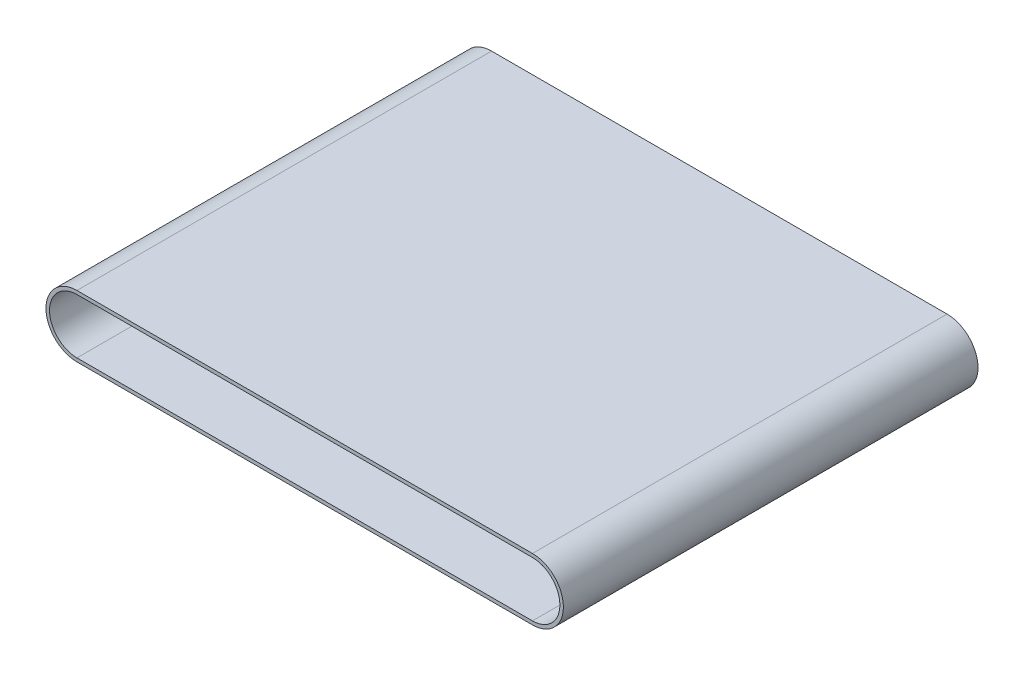
ISO-10303-21;
HEADER;
FILE_DESCRIPTION(('STEP AP214'),'2;1');
FILE_NAME('part.step','',(''),(''),'','','');
FILE_SCHEMA(('AUTOMOTIVE_DESIGN { 1 0 10303 214 1 1 1 1 }'));
ENDSEC;
DATA;
#1=APPLICATION_CONTEXT('core data for automotive mechanical design processes');
#2=APPLICATION_PROTOCOL_DEFINITION('international standard','automotive_design',2000,#1);
#3=PRODUCT_CONTEXT('',#1,'mechanical');
#4=PRODUCT('Part','Part','',(#3));
#5=PRODUCT_RELATED_PRODUCT_CATEGORY('part','',(#4));
#6=PRODUCT_DEFINITION_FORMATION('','',#4);
#7=PRODUCT_DEFINITION_CONTEXT('part definition',#1,'design');
#8=PRODUCT_DEFINITION('design','',#6,#7);
#9=PRODUCT_DEFINITION_SHAPE('','',#8);
#10=(LENGTH_UNIT() NAMED_UNIT(*) SI_UNIT(.MILLI.,.METRE.));
#11=(NAMED_UNIT(*) PLANE_ANGLE_UNIT() SI_UNIT($,.RADIAN.));
#12=(NAMED_UNIT(*) SI_UNIT($,.STERADIAN.) SOLID_ANGLE_UNIT());
#13=UNCERTAINTY_MEASURE_WITH_UNIT(LENGTH_MEASURE(1.E-05),#10,'distance_accuracy_value','');
#14=(GEOMETRIC_REPRESENTATION_CONTEXT(3) GLOBAL_UNCERTAINTY_ASSIGNED_CONTEXT((#13)) GLOBAL_UNIT_ASSIGNED_CONTEXT((#10,
#11,#12)) REPRESENTATION_CONTEXT('',''));
#15=CARTESIAN_POINT('',(0.,0.,0.));
#16=DIRECTION('',(0.,0.,1.));
#17=DIRECTION('',(1.,0.,0.));
#18=AXIS2_PLACEMENT_3D('',#15,#16,#17);
#19=CARTESIAN_POINT('',(-390.,0.,-177.5));
#20=DIRECTION('',(0.,0.,1.));
#21=DIRECTION('',(1.,0.,0.));
#22=AXIS2_PLACEMENT_3D('',#19,#20,#21);
#23=CYLINDRICAL_SURFACE('',#22,26.5);
#24=CARTESIAN_POINT('',(-390.,0.,177.5));
#25=DIRECTION('',(0.,0.,1.));
#26=DIRECTION('',(1.,0.,0.));
#27=AXIS2_PLACEMENT_3D('',#24,#25,#26);
#28=CIRCLE('',#27,26.5);
#29=CARTESIAN_POINT('',(-390.,26.4999999999999,177.5));
#30=VERTEX_POINT('',#29);
#31=CARTESIAN_POINT('',(-390.,-26.5,177.5));
#32=VERTEX_POINT('',#31);
#33=EDGE_CURVE('E131',#30,#32,#28,.T.);
#34=ORIENTED_EDGE('',*,*,#33,.F.);
#35=DIRECTION('',(0.,0.,1.));
#36=VECTOR('',#35,1.);
#37=CARTESIAN_POINT('',(-390.,26.4999999999999,-177.5));
#38=LINE('',#37,#36);
#39=CARTESIAN_POINT('',(-390.,26.4999999999999,-177.5));
#40=VERTEX_POINT('',#39);
#41=EDGE_CURVE('E11',#40,#30,#38,.T.);
#42=ORIENTED_EDGE('',*,*,#41,.F.);
#43=CARTESIAN_POINT('',(-390.,0.,-177.5));
#44=DIRECTION('',(0.,0.,1.));
#45=DIRECTION('',(1.,0.,0.));
#46=AXIS2_PLACEMENT_3D('',#43,#44,#45);
#47=CIRCLE('',#46,26.5);
#48=CARTESIAN_POINT('',(-390.,-26.5,-177.5));
#49=VERTEX_POINT('',#48);
#50=EDGE_CURVE('E135',#40,#49,#47,.T.);
#51=ORIENTED_EDGE('',*,*,#50,.T.);
#52=DIRECTION('',(0.,0.,1.));
#53=VECTOR('',#52,1.);
#54=CARTESIAN_POINT('',(-390.,-26.5,-177.5));
#55=LINE('',#54,#53);
#56=EDGE_CURVE('E36',#49,#32,#55,.T.);
#57=ORIENTED_EDGE('',*,*,#56,.T.);
#58=EDGE_LOOP('',(#34,#42,#51,#57));
#59=FACE_BOUND('',#58,.T.);
#60=ADVANCED_FACE('F33',(#59),#23,.T.);
#61=CARTESIAN_POINT('',(0.,26.5,-177.5));
#62=DIRECTION('',(0.,1.,0.));
#63=DIRECTION('',(-1.,0.,0.));
#64=AXIS2_PLACEMENT_3D('',#61,#62,#63);
#65=PLANE('',#64);
#66=DIRECTION('',(-1.,0.,0.));
#67=VECTOR('',#66,1.);
#68=CARTESIAN_POINT('',(0.,26.5,177.5));
#69=LINE('',#68,#67);
#70=CARTESIAN_POINT('',(0.,26.5,177.5));
#71=VERTEX_POINT('',#70);
#72=EDGE_CURVE('E139',#71,#30,#69,.T.);
#73=ORIENTED_EDGE('',*,*,#72,.F.);
#74=DIRECTION('',(0.,0.,1.));
#75=VECTOR('',#74,1.);
#76=CARTESIAN_POINT('',(0.,26.5,-177.5));
#77=LINE('',#76,#75);
#78=CARTESIAN_POINT('',(0.,26.5,-177.5));
#79=VERTEX_POINT('',#78);
#80=EDGE_CURVE('E41',#79,#71,#77,.T.);
#81=ORIENTED_EDGE('',*,*,#80,.F.);
#82=DIRECTION('',(-1.,0.,0.));
#83=VECTOR('',#82,1.);
#84=CARTESIAN_POINT('',(0.,26.5,-177.5));
#85=LINE('',#84,#83);
#86=EDGE_CURVE('E145',#79,#40,#85,.T.);
#87=ORIENTED_EDGE('',*,*,#86,.T.);
#88=ORIENTED_EDGE('',*,*,#41,.T.);
#89=EDGE_LOOP('',(#73,#81,#87,#88));
#90=FACE_BOUND('',#89,.T.);
#91=ADVANCED_FACE('F171',(#90),#65,.T.);
#92=CARTESIAN_POINT('',(0.,0.,-177.5));
#93=DIRECTION('',(0.,0.,1.));
#94=DIRECTION('',(1.,0.,0.));
#95=AXIS2_PLACEMENT_3D('',#92,#93,#94);
#96=CYLINDRICAL_SURFACE('',#95,26.5);
#97=CARTESIAN_POINT('',(0.,0.,177.5));
#98=DIRECTION('',(0.,0.,1.));
#99=DIRECTION('',(1.,0.,0.));
#100=AXIS2_PLACEMENT_3D('',#97,#98,#99);
#101=CIRCLE('',#100,26.5);
#102=CARTESIAN_POINT('',(0.,-26.5,177.5));
#103=VERTEX_POINT('',#102);
#104=EDGE_CURVE('E153',#103,#71,#101,.T.);
#105=ORIENTED_EDGE('',*,*,#104,.F.);
#106=DIRECTION('',(0.,0.,1.));
#107=VECTOR('',#106,1.);
#108=CARTESIAN_POINT('',(0.,-26.5,-177.5));
#109=LINE('',#108,#107);
#110=CARTESIAN_POINT('',(0.,-26.5,-177.5));
#111=VERTEX_POINT('',#110);
#112=EDGE_CURVE('E158',#111,#103,#109,.T.);
#113=ORIENTED_EDGE('',*,*,#112,.F.);
#114=CARTESIAN_POINT('',(0.,0.,-177.5));
#115=DIRECTION('',(0.,0.,1.));
#116=DIRECTION('',(1.,0.,0.));
#117=AXIS2_PLACEMENT_3D('',#114,#115,#116);
#118=CIRCLE('',#117,26.5);
#119=EDGE_CURVE('E142',#111,#79,#118,.T.);
#120=ORIENTED_EDGE('',*,*,#119,.T.);
#121=ORIENTED_EDGE('',*,*,#80,.T.);
#122=EDGE_LOOP('',(#105,#113,#120,#121));
#123=FACE_BOUND('',#122,.T.);
#124=ADVANCED_FACE('F175',(#123),#96,.T.);
#125=CARTESIAN_POINT('',(-390.,-26.5,-177.5));
#126=DIRECTION('',(0.,-1.,0.));
#127=DIRECTION('',(1.,0.,0.));
#128=AXIS2_PLACEMENT_3D('',#125,#126,#127);
#129=PLANE('',#128);
#130=DIRECTION('',(1.,0.,0.));
#131=VECTOR('',#130,1.);
#132=CARTESIAN_POINT('',(-390.,-26.5,177.5));
#133=LINE('',#132,#131);
#134=EDGE_CURVE('E150',#32,#103,#133,.T.);
#135=ORIENTED_EDGE('',*,*,#134,.F.);
#136=ORIENTED_EDGE('',*,*,#56,.F.);
#137=DIRECTION('',(1.,0.,0.));
#138=VECTOR('',#137,1.);
#139=CARTESIAN_POINT('',(-390.,-26.5,-177.5));
#140=LINE('',#139,#138);
#141=EDGE_CURVE('E138',#49,#111,#140,.T.);
#142=ORIENTED_EDGE('',*,*,#141,.T.);
#143=ORIENTED_EDGE('',*,*,#112,.T.);
#144=EDGE_LOOP('',(#135,#136,#142,#143));
#145=FACE_BOUND('',#144,.T.);
#146=ADVANCED_FACE('F166',(#145),#129,.T.);
#147=CARTESIAN_POINT('',(-390.,0.,-177.5));
#148=DIRECTION('',(0.,0.,1.));
#149=DIRECTION('',(1.,0.,0.));
#150=AXIS2_PLACEMENT_3D('',#147,#148,#149);
#151=PLANE('',#150);
#152=DIRECTION('',(1.,0.,0.));
#153=VECTOR('',#152,1.);
#154=CARTESIAN_POINT('',(0.,-23.4999999999999,-177.5));
#155=LINE('',#154,#153);
#156=CARTESIAN_POINT('',(-390.,-23.4999999999999,-177.5));
#157=VERTEX_POINT('',#156);
#158=CARTESIAN_POINT('',(0.,-23.4999999999999,-177.5));
#159=VERTEX_POINT('',#158);
#160=EDGE_CURVE('E106',#157,#159,#155,.T.);
#161=ORIENTED_EDGE('',*,*,#160,.T.);
#162=CARTESIAN_POINT('',(0.,0.,-177.5));
#163=DIRECTION('',(0.,0.,1.));
#164=DIRECTION('',(-1.,0.,0.));
#165=AXIS2_PLACEMENT_3D('',#162,#163,#164);
#166=CIRCLE('',#165,23.4999999999999);
#167=CARTESIAN_POINT('',(0.,23.4999999999999,-177.5));
#168=VERTEX_POINT('',#167);
#169=EDGE_CURVE('E100',#159,#168,#166,.T.);
#170=ORIENTED_EDGE('',*,*,#169,.T.);
#171=DIRECTION('',(-1.,0.,0.));
#172=VECTOR('',#171,1.);
#173=CARTESIAN_POINT('',(-390.,23.4999999999998,-177.5));
#174=LINE('',#173,#172);
#175=CARTESIAN_POINT('',(-390.,23.4999999999998,-177.5));
#176=VERTEX_POINT('',#175);
#177=EDGE_CURVE('E109',#168,#176,#174,.T.);
#178=ORIENTED_EDGE('',*,*,#177,.T.);
#179=CARTESIAN_POINT('',(-390.,0.,-177.5));
#180=DIRECTION('',(0.,0.,1.));
#181=DIRECTION('',(-1.,0.,0.));
#182=AXIS2_PLACEMENT_3D('',#179,#180,#181);
#183=CIRCLE('',#182,23.4999999999999);
#184=EDGE_CURVE('E49',#176,#157,#183,.T.);
#185=ORIENTED_EDGE('',*,*,#184,.T.);
#186=EDGE_LOOP('',(#161,#170,#178,#185));
#187=FACE_BOUND('',#186,.T.);
#188=ORIENTED_EDGE('',*,*,#50,.F.);
#189=ORIENTED_EDGE('',*,*,#86,.F.);
#190=ORIENTED_EDGE('',*,*,#119,.F.);
#191=ORIENTED_EDGE('',*,*,#141,.F.);
#192=EDGE_LOOP('',(#188,#189,#190,#191));
#193=FACE_BOUND('',#192,.T.);
#194=ADVANCED_FACE('F113',(#187,#193),#151,.F.);
#195=CARTESIAN_POINT('',(-390.,0.,177.5));
#196=DIRECTION('',(0.,0.,1.));
#197=DIRECTION('',(1.,0.,0.));
#198=AXIS2_PLACEMENT_3D('',#195,#196,#197);
#199=PLANE('',#198);
#200=CARTESIAN_POINT('',(0.,0.,177.5));
#201=DIRECTION('',(0.,0.,1.));
#202=DIRECTION('',(-1.,0.,0.));
#203=AXIS2_PLACEMENT_3D('',#200,#201,#202);
#204=CIRCLE('',#203,23.4999999999999);
#205=CARTESIAN_POINT('',(0.,-23.4999999999999,177.5));
#206=VERTEX_POINT('',#205);
#207=CARTESIAN_POINT('',(0.,23.4999999999999,177.5));
#208=VERTEX_POINT('',#207);
#209=EDGE_CURVE('E57',#206,#208,#204,.T.);
#210=ORIENTED_EDGE('',*,*,#209,.F.);
#211=DIRECTION('',(1.,0.,0.));
#212=VECTOR('',#211,1.);
#213=CARTESIAN_POINT('',(0.,-23.4999999999999,177.5));
#214=LINE('',#213,#212);
#215=CARTESIAN_POINT('',(-390.,-23.4999999999999,177.5));
#216=VERTEX_POINT('',#215);
#217=EDGE_CURVE('E116',#216,#206,#214,.T.);
#218=ORIENTED_EDGE('',*,*,#217,.F.);
#219=CARTESIAN_POINT('',(-390.,0.,177.5));
#220=DIRECTION('',(0.,0.,1.));
#221=DIRECTION('',(-1.,0.,0.));
#222=AXIS2_PLACEMENT_3D('',#219,#220,#221);
#223=CIRCLE('',#222,23.4999999999999);
#224=CARTESIAN_POINT('',(-390.,23.4999999999998,177.5));
#225=VERTEX_POINT('',#224);
#226=EDGE_CURVE('E119',#225,#216,#223,.T.);
#227=ORIENTED_EDGE('',*,*,#226,.F.);
#228=DIRECTION('',(-1.,0.,0.));
#229=VECTOR('',#228,1.);
#230=CARTESIAN_POINT('',(-390.,23.4999999999998,177.5));
#231=LINE('',#230,#229);
#232=EDGE_CURVE('E125',#208,#225,#231,.T.);
#233=ORIENTED_EDGE('',*,*,#232,.F.);
#234=EDGE_LOOP('',(#210,#218,#227,#233));
#235=FACE_BOUND('',#234,.T.);
#236=ORIENTED_EDGE('',*,*,#33,.T.);
#237=ORIENTED_EDGE('',*,*,#134,.T.);
#238=ORIENTED_EDGE('',*,*,#104,.T.);
#239=ORIENTED_EDGE('',*,*,#72,.T.);
#240=EDGE_LOOP('',(#236,#237,#238,#239));
#241=FACE_BOUND('',#240,.T.);
#242=ADVANCED_FACE('F168',(#235,#241),#199,.T.);
#243=CARTESIAN_POINT('',(0.,0.,-177.5));
#244=DIRECTION('',(0.,0.,1.));
#245=DIRECTION('',(1.,0.,0.));
#246=AXIS2_PLACEMENT_3D('',#243,#244,#245);
#247=CYLINDRICAL_SURFACE('',#246,23.4999999999999);
#248=ORIENTED_EDGE('',*,*,#209,.T.);
#249=DIRECTION('',(0.,0.,1.));
#250=VECTOR('',#249,1.);
#251=CARTESIAN_POINT('',(0.,23.4999999999999,-177.5));
#252=LINE('',#251,#250);
#253=EDGE_CURVE('E96',#168,#208,#252,.T.);
#254=ORIENTED_EDGE('',*,*,#253,.F.);
#255=ORIENTED_EDGE('',*,*,#169,.F.);
#256=DIRECTION('',(0.,0.,1.));
#257=VECTOR('',#256,1.);
#258=CARTESIAN_POINT('',(0.,-23.4999999999999,-177.5));
#259=LINE('',#258,#257);
#260=EDGE_CURVE('E129',#159,#206,#259,.T.);
#261=ORIENTED_EDGE('',*,*,#260,.T.);
#262=EDGE_LOOP('',(#248,#254,#255,#261));
#263=FACE_BOUND('',#262,.T.);
#264=ADVANCED_FACE('F98',(#263),#247,.F.);
#265=CARTESIAN_POINT('',(0.,-23.4999999999999,-177.5));
#266=DIRECTION('',(0.,-1.,0.));
#267=DIRECTION('',(1.,0.,0.));
#268=AXIS2_PLACEMENT_3D('',#265,#266,#267);
#269=PLANE('',#268);
#270=ORIENTED_EDGE('',*,*,#217,.T.);
#271=ORIENTED_EDGE('',*,*,#260,.F.);
#272=ORIENTED_EDGE('',*,*,#160,.F.);
#273=DIRECTION('',(0.,0.,1.));
#274=VECTOR('',#273,1.);
#275=CARTESIAN_POINT('',(-390.,-23.4999999999999,-177.5));
#276=LINE('',#275,#274);
#277=EDGE_CURVE('E132',#157,#216,#276,.T.);
#278=ORIENTED_EDGE('',*,*,#277,.T.);
#279=EDGE_LOOP('',(#270,#271,#272,#278));
#280=FACE_BOUND('',#279,.T.);
#281=ADVANCED_FACE('F226',(#280),#269,.F.);
#282=CARTESIAN_POINT('',(-390.,0.,-177.5));
#283=DIRECTION('',(0.,0.,1.));
#284=DIRECTION('',(1.,0.,0.));
#285=AXIS2_PLACEMENT_3D('',#282,#283,#284);
#286=CYLINDRICAL_SURFACE('',#285,23.4999999999999);
#287=ORIENTED_EDGE('',*,*,#226,.T.);
#288=ORIENTED_EDGE('',*,*,#277,.F.);
#289=ORIENTED_EDGE('',*,*,#184,.F.);
#290=DIRECTION('',(0.,0.,1.));
#291=VECTOR('',#290,1.);
#292=CARTESIAN_POINT('',(-390.,23.4999999999998,-177.5));
#293=LINE('',#292,#291);
#294=EDGE_CURVE('E105',#176,#225,#293,.T.);
#295=ORIENTED_EDGE('',*,*,#294,.T.);
#296=EDGE_LOOP('',(#287,#288,#289,#295));
#297=FACE_BOUND('',#296,.T.);
#298=ADVANCED_FACE('F235',(#297),#286,.F.);
#299=CARTESIAN_POINT('',(-390.,23.4999999999998,-177.5));
#300=DIRECTION('',(0.,1.,0.));
#301=DIRECTION('',(-1.,0.,0.));
#302=AXIS2_PLACEMENT_3D('',#299,#300,#301);
#303=PLANE('',#302);
#304=ORIENTED_EDGE('',*,*,#232,.T.);
#305=ORIENTED_EDGE('',*,*,#294,.F.);
#306=ORIENTED_EDGE('',*,*,#177,.F.);
#307=ORIENTED_EDGE('',*,*,#253,.T.);
#308=EDGE_LOOP('',(#304,#305,#306,#307));
#309=FACE_BOUND('',#308,.T.);
#310=ADVANCED_FACE('F110',(#309),#303,.F.);
#311=CLOSED_SHELL('',(#60,#91,#124,#146,#194,#242,#264,#281,#298,#310));
#312=MANIFOLD_SOLID_BREP('B2',#311);
#313=ADVANCED_BREP_SHAPE_REPRESENTATION('',(#18,#312),#14);
#314=SHAPE_DEFINITION_REPRESENTATION(#9,#313);
ENDSEC;
END-ISO-10303-21;
